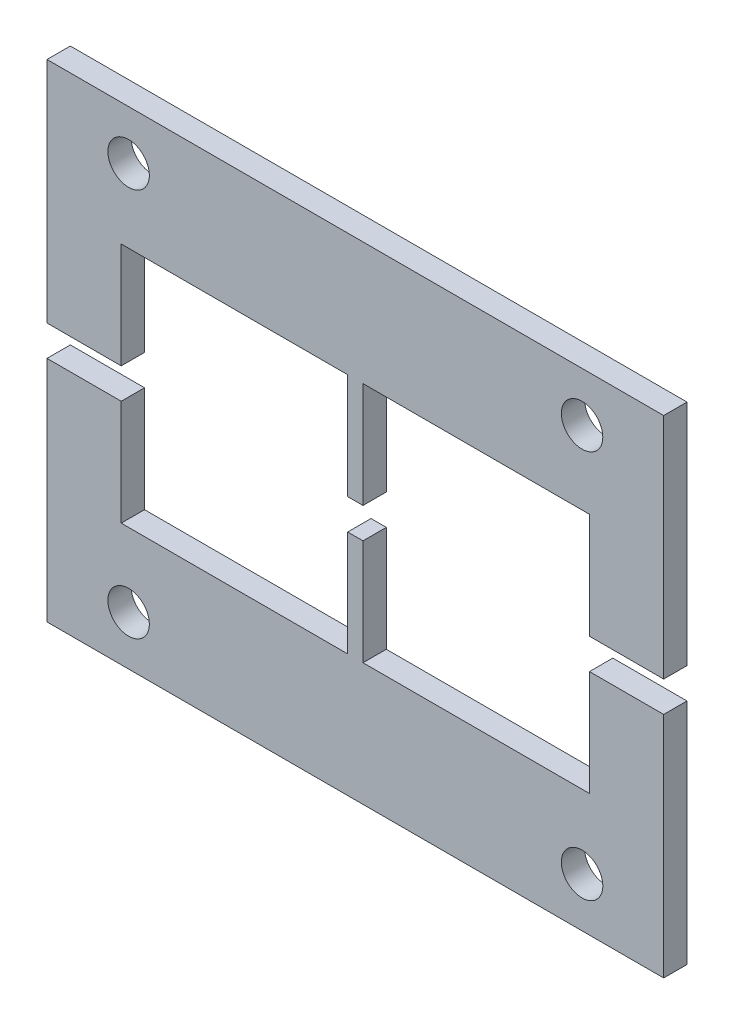
ISO-10303-21;
HEADER;
FILE_DESCRIPTION(('STEP AP214'),'2;1');
FILE_NAME('part.step','',(''),(''),'','','');
FILE_SCHEMA(('AUTOMOTIVE_DESIGN { 1 0 10303 214 1 1 1 1 }'));
ENDSEC;
DATA;
#1=APPLICATION_CONTEXT('core data for automotive mechanical design processes');
#2=APPLICATION_PROTOCOL_DEFINITION('international standard','automotive_design',2000,#1);
#3=PRODUCT_CONTEXT('',#1,'mechanical');
#4=PRODUCT('Part','Part','',(#3));
#5=PRODUCT_RELATED_PRODUCT_CATEGORY('part','',(#4));
#6=PRODUCT_DEFINITION_FORMATION('','',#4);
#7=PRODUCT_DEFINITION_CONTEXT('part definition',#1,'design');
#8=PRODUCT_DEFINITION('design','',#6,#7);
#9=PRODUCT_DEFINITION_SHAPE('','',#8);
#10=(LENGTH_UNIT() NAMED_UNIT(*) SI_UNIT(.MILLI.,.METRE.));
#11=(NAMED_UNIT(*) PLANE_ANGLE_UNIT() SI_UNIT($,.RADIAN.));
#12=(NAMED_UNIT(*) SI_UNIT($,.STERADIAN.) SOLID_ANGLE_UNIT());
#13=UNCERTAINTY_MEASURE_WITH_UNIT(LENGTH_MEASURE(1.E-05),#10,'distance_accuracy_value','');
#14=(GEOMETRIC_REPRESENTATION_CONTEXT(3) GLOBAL_UNCERTAINTY_ASSIGNED_CONTEXT((#13)) GLOBAL_UNIT_ASSIGNED_CONTEXT((#10,
#11,#12)) REPRESENTATION_CONTEXT('',''));
#15=CARTESIAN_POINT('',(0.,0.,0.));
#16=DIRECTION('',(0.,0.,1.));
#17=DIRECTION('',(1.,0.,0.));
#18=AXIS2_PLACEMENT_3D('',#15,#16,#17);
#19=CARTESIAN_POINT('',(0.,0.,2.286));
#20=DIRECTION('',(0.,0.,-1.));
#21=DIRECTION('',(-1.,0.,0.));
#22=AXIS2_PLACEMENT_3D('',#19,#20,#21);
#23=PLANE('',#22);
#24=DIRECTION('',(0.,-1.,0.));
#25=VECTOR('',#24,1.);
#26=CARTESIAN_POINT('',(22.95,-1.50000000000001,2.286));
#27=LINE('',#26,#25);
#28=CARTESIAN_POINT('',(22.95,-1.50000000000001,2.286));
#29=VERTEX_POINT('',#28);
#30=CARTESIAN_POINT('',(22.95,-11.85,2.286));
#31=VERTEX_POINT('',#30);
#32=EDGE_CURVE('E187',#29,#31,#27,.T.);
#33=ORIENTED_EDGE('',*,*,#32,.T.);
#34=DIRECTION('',(-1.,0.,0.));
#35=VECTOR('',#34,1.);
#36=CARTESIAN_POINT('',(22.95,-11.85,2.286));
#37=LINE('',#36,#35);
#38=CARTESIAN_POINT('',(0.750000000000001,-11.85,2.286));
#39=VERTEX_POINT('',#38);
#40=EDGE_CURVE('E115',#31,#39,#37,.T.);
#41=ORIENTED_EDGE('',*,*,#40,.T.);
#42=DIRECTION('',(0.,1.,0.));
#43=VECTOR('',#42,1.);
#44=CARTESIAN_POINT('',(0.750000000000001,-11.85,2.286));
#45=LINE('',#44,#43);
#46=CARTESIAN_POINT('',(0.750000000000002,-1.5,2.286));
#47=VERTEX_POINT('',#46);
#48=EDGE_CURVE('E214',#39,#47,#45,.T.);
#49=ORIENTED_EDGE('',*,*,#48,.T.);
#50=DIRECTION('',(-1.,0.,0.));
#51=VECTOR('',#50,1.);
#52=CARTESIAN_POINT('',(0.750000000000002,-1.5,2.286));
#53=LINE('',#52,#51);
#54=CARTESIAN_POINT('',(-0.750000000000002,-1.5,2.286));
#55=VERTEX_POINT('',#54);
#56=EDGE_CURVE('E233',#47,#55,#53,.T.);
#57=ORIENTED_EDGE('',*,*,#56,.T.);
#58=DIRECTION('',(0.,-1.,0.));
#59=VECTOR('',#58,1.);
#60=CARTESIAN_POINT('',(-0.750000000000001,-11.85,2.286));
#61=LINE('',#60,#59);
#62=CARTESIAN_POINT('',(-0.750000000000001,-11.85,2.286));
#63=VERTEX_POINT('',#62);
#64=EDGE_CURVE('E230',#55,#63,#61,.T.);
#65=ORIENTED_EDGE('',*,*,#64,.T.);
#66=DIRECTION('',(-1.,0.,0.));
#67=VECTOR('',#66,1.);
#68=CARTESIAN_POINT('',(-22.95,-11.85,2.286));
#69=LINE('',#68,#67);
#70=CARTESIAN_POINT('',(-22.95,-11.85,2.286));
#71=VERTEX_POINT('',#70);
#72=EDGE_CURVE('E232',#63,#71,#69,.T.);
#73=ORIENTED_EDGE('',*,*,#72,.T.);
#74=DIRECTION('',(0.,1.,0.));
#75=VECTOR('',#74,1.);
#76=CARTESIAN_POINT('',(-22.95,-1.50000000000001,2.286));
#77=LINE('',#76,#75);
#78=CARTESIAN_POINT('',(-22.95,-1.50000000000001,2.286));
#79=VERTEX_POINT('',#78);
#80=EDGE_CURVE('E235',#71,#79,#77,.T.);
#81=ORIENTED_EDGE('',*,*,#80,.T.);
#82=DIRECTION('',(-1.,0.,0.));
#83=VECTOR('',#82,1.);
#84=CARTESIAN_POINT('',(-22.95,-1.50000000000001,2.286));
#85=LINE('',#84,#83);
#86=CARTESIAN_POINT('',(-30.226,-1.5,2.286));
#87=VERTEX_POINT('',#86);
#88=EDGE_CURVE('E241',#79,#87,#85,.T.);
#89=ORIENTED_EDGE('',*,*,#88,.T.);
#90=DIRECTION('',(0.,-1.,0.));
#91=VECTOR('',#90,1.);
#92=CARTESIAN_POINT('',(-30.226,-23.876,2.286));
#93=LINE('',#92,#91);
#94=CARTESIAN_POINT('',(-30.226,-23.876,2.286));
#95=VERTEX_POINT('',#94);
#96=EDGE_CURVE('E146',#87,#95,#93,.T.);
#97=ORIENTED_EDGE('',*,*,#96,.T.);
#98=DIRECTION('',(1.,0.,0.));
#99=VECTOR('',#98,1.);
#100=CARTESIAN_POINT('',(-30.226,-23.876,2.286));
#101=LINE('',#100,#99);
#102=CARTESIAN_POINT('',(30.226,-23.876,2.286));
#103=VERTEX_POINT('',#102);
#104=EDGE_CURVE('E140',#95,#103,#101,.T.);
#105=ORIENTED_EDGE('',*,*,#104,.T.);
#106=DIRECTION('',(0.,1.,0.));
#107=VECTOR('',#106,1.);
#108=CARTESIAN_POINT('',(30.226,-23.876,2.286));
#109=LINE('',#108,#107);
#110=CARTESIAN_POINT('',(30.226,-1.5,2.286));
#111=VERTEX_POINT('',#110);
#112=EDGE_CURVE('E144',#103,#111,#109,.T.);
#113=ORIENTED_EDGE('',*,*,#112,.T.);
#114=DIRECTION('',(-1.,0.,0.));
#115=VECTOR('',#114,1.);
#116=CARTESIAN_POINT('',(22.95,-1.50000000000001,2.286));
#117=LINE('',#116,#115);
#118=EDGE_CURVE('E60',#111,#29,#117,.T.);
#119=ORIENTED_EDGE('',*,*,#118,.T.);
#120=EDGE_LOOP('',(#33,#41,#49,#57,#65,#73,#81,#89,#97,#105,#113,#119));
#121=FACE_BOUND('',#120,.T.);
#122=CARTESIAN_POINT('',(22.225,-19.05,2.286));
#123=DIRECTION('',(0.,0.,1.));
#124=DIRECTION('',(-1.,0.,0.));
#125=AXIS2_PLACEMENT_3D('',#122,#123,#124);
#126=CIRCLE('',#125,2.032);
#127=CARTESIAN_POINT('',(20.193,-19.05,2.286));
#128=VERTEX_POINT('',#127);
#129=EDGE_CURVE('E168',#128,#128,#126,.T.);
#130=ORIENTED_EDGE('',*,*,#129,.F.);
#131=EDGE_LOOP('',(#130));
#132=FACE_BOUND('',#131,.T.);
#133=CARTESIAN_POINT('',(-22.225,-19.05,2.286));
#134=DIRECTION('',(0.,0.,1.));
#135=DIRECTION('',(1.,0.,0.));
#136=AXIS2_PLACEMENT_3D('',#133,#134,#135);
#137=CIRCLE('',#136,2.032);
#138=CARTESIAN_POINT('',(-20.193,-19.05,2.286));
#139=VERTEX_POINT('',#138);
#140=EDGE_CURVE('E282',#139,#139,#137,.T.);
#141=ORIENTED_EDGE('',*,*,#140,.F.);
#142=EDGE_LOOP('',(#141));
#143=FACE_BOUND('',#142,.T.);
#144=ADVANCED_FACE('F43',(#121,#132,#143),#23,.F.);
#145=CARTESIAN_POINT('',(0.,0.,0.));
#146=DIRECTION('',(0.,0.,-1.));
#147=DIRECTION('',(-1.,0.,0.));
#148=AXIS2_PLACEMENT_3D('',#145,#146,#147);
#149=PLANE('',#148);
#150=CARTESIAN_POINT('',(22.225,-19.05,0.));
#151=DIRECTION('',(0.,0.,1.));
#152=DIRECTION('',(-1.,0.,0.));
#153=AXIS2_PLACEMENT_3D('',#150,#151,#152);
#154=CIRCLE('',#153,2.032);
#155=CARTESIAN_POINT('',(20.193,-19.05,0.));
#156=VERTEX_POINT('',#155);
#157=EDGE_CURVE('E287',#156,#156,#154,.T.);
#158=ORIENTED_EDGE('',*,*,#157,.T.);
#159=EDGE_LOOP('',(#158));
#160=FACE_BOUND('',#159,.T.);
#161=DIRECTION('',(0.,-1.,0.));
#162=VECTOR('',#161,1.);
#163=CARTESIAN_POINT('',(22.95,-1.50000000000001,0.));
#164=LINE('',#163,#162);
#165=CARTESIAN_POINT('',(22.95,-1.50000000000001,0.));
#166=VERTEX_POINT('',#165);
#167=CARTESIAN_POINT('',(22.95,-11.85,0.));
#168=VERTEX_POINT('',#167);
#169=EDGE_CURVE('E164',#166,#168,#164,.T.);
#170=ORIENTED_EDGE('',*,*,#169,.F.);
#171=DIRECTION('',(-1.,0.,0.));
#172=VECTOR('',#171,1.);
#173=CARTESIAN_POINT('',(22.95,-1.50000000000001,0.));
#174=LINE('',#173,#172);
#175=CARTESIAN_POINT('',(30.226,-1.5,0.));
#176=VERTEX_POINT('',#175);
#177=EDGE_CURVE('E107',#176,#166,#174,.T.);
#178=ORIENTED_EDGE('',*,*,#177,.F.);
#179=DIRECTION('',(0.,1.,0.));
#180=VECTOR('',#179,1.);
#181=CARTESIAN_POINT('',(30.226,-23.876,0.));
#182=LINE('',#181,#180);
#183=CARTESIAN_POINT('',(30.226,-23.876,0.));
#184=VERTEX_POINT('',#183);
#185=EDGE_CURVE('E101',#184,#176,#182,.T.);
#186=ORIENTED_EDGE('',*,*,#185,.F.);
#187=DIRECTION('',(1.,0.,0.));
#188=VECTOR('',#187,1.);
#189=CARTESIAN_POINT('',(-30.226,-23.876,0.));
#190=LINE('',#189,#188);
#191=CARTESIAN_POINT('',(-30.226,-23.876,0.));
#192=VERTEX_POINT('',#191);
#193=EDGE_CURVE('E154',#192,#184,#190,.T.);
#194=ORIENTED_EDGE('',*,*,#193,.F.);
#195=DIRECTION('',(0.,-1.,0.));
#196=VECTOR('',#195,1.);
#197=CARTESIAN_POINT('',(-30.226,-23.876,0.));
#198=LINE('',#197,#196);
#199=CARTESIAN_POINT('',(-30.226,-1.5,0.));
#200=VERTEX_POINT('',#199);
#201=EDGE_CURVE('E182',#200,#192,#198,.T.);
#202=ORIENTED_EDGE('',*,*,#201,.F.);
#203=DIRECTION('',(-1.,0.,0.));
#204=VECTOR('',#203,1.);
#205=CARTESIAN_POINT('',(-22.95,-1.50000000000001,0.));
#206=LINE('',#205,#204);
#207=CARTESIAN_POINT('',(-22.95,-1.50000000000001,0.));
#208=VERTEX_POINT('',#207);
#209=EDGE_CURVE('E180',#208,#200,#206,.T.);
#210=ORIENTED_EDGE('',*,*,#209,.F.);
#211=DIRECTION('',(0.,1.,0.));
#212=VECTOR('',#211,1.);
#213=CARTESIAN_POINT('',(-22.95,-1.50000000000001,0.));
#214=LINE('',#213,#212);
#215=CARTESIAN_POINT('',(-22.95,-11.85,0.));
#216=VERTEX_POINT('',#215);
#217=EDGE_CURVE('E178',#216,#208,#214,.T.);
#218=ORIENTED_EDGE('',*,*,#217,.F.);
#219=DIRECTION('',(-1.,0.,0.));
#220=VECTOR('',#219,1.);
#221=CARTESIAN_POINT('',(-22.95,-11.85,0.));
#222=LINE('',#221,#220);
#223=CARTESIAN_POINT('',(-0.750000000000001,-11.85,0.));
#224=VERTEX_POINT('',#223);
#225=EDGE_CURVE('E176',#224,#216,#222,.T.);
#226=ORIENTED_EDGE('',*,*,#225,.F.);
#227=DIRECTION('',(0.,-1.,0.));
#228=VECTOR('',#227,1.);
#229=CARTESIAN_POINT('',(-0.750000000000001,-11.85,0.));
#230=LINE('',#229,#228);
#231=CARTESIAN_POINT('',(-0.750000000000002,-1.5,0.));
#232=VERTEX_POINT('',#231);
#233=EDGE_CURVE('E174',#232,#224,#230,.T.);
#234=ORIENTED_EDGE('',*,*,#233,.F.);
#235=DIRECTION('',(-1.,0.,0.));
#236=VECTOR('',#235,1.);
#237=CARTESIAN_POINT('',(0.750000000000002,-1.5,0.));
#238=LINE('',#237,#236);
#239=CARTESIAN_POINT('',(0.750000000000002,-1.5,0.));
#240=VERTEX_POINT('',#239);
#241=EDGE_CURVE('E172',#240,#232,#238,.T.);
#242=ORIENTED_EDGE('',*,*,#241,.F.);
#243=DIRECTION('',(0.,1.,0.));
#244=VECTOR('',#243,1.);
#245=CARTESIAN_POINT('',(0.750000000000001,-11.85,0.));
#246=LINE('',#245,#244);
#247=CARTESIAN_POINT('',(0.750000000000001,-11.85,0.));
#248=VERTEX_POINT('',#247);
#249=EDGE_CURVE('E170',#248,#240,#246,.T.);
#250=ORIENTED_EDGE('',*,*,#249,.F.);
#251=DIRECTION('',(-1.,0.,0.));
#252=VECTOR('',#251,1.);
#253=CARTESIAN_POINT('',(22.95,-11.85,0.));
#254=LINE('',#253,#252);
#255=EDGE_CURVE('E167',#168,#248,#254,.T.);
#256=ORIENTED_EDGE('',*,*,#255,.F.);
#257=EDGE_LOOP('',(#170,#178,#186,#194,#202,#210,#218,#226,#234,#242,#250,#256));
#258=FACE_BOUND('',#257,.T.);
#259=CARTESIAN_POINT('',(-22.225,-19.05,0.));
#260=DIRECTION('',(0.,0.,1.));
#261=DIRECTION('',(1.,0.,0.));
#262=AXIS2_PLACEMENT_3D('',#259,#260,#261);
#263=CIRCLE('',#262,2.032);
#264=CARTESIAN_POINT('',(-20.193,-19.05,0.));
#265=VERTEX_POINT('',#264);
#266=EDGE_CURVE('E285',#265,#265,#263,.T.);
#267=ORIENTED_EDGE('',*,*,#266,.T.);
#268=EDGE_LOOP('',(#267));
#269=FACE_BOUND('',#268,.T.);
#270=ADVANCED_FACE('F218',(#160,#258,#269),#149,.T.);
#271=CARTESIAN_POINT('',(22.95,-1.50000000000001,2.286));
#272=DIRECTION('',(1.,0.,0.));
#273=DIRECTION('',(0.,1.,0.));
#274=AXIS2_PLACEMENT_3D('',#271,#272,#273);
#275=PLANE('',#274);
#276=ORIENTED_EDGE('',*,*,#169,.T.);
#277=DIRECTION('',(0.,0.,-1.));
#278=VECTOR('',#277,1.);
#279=CARTESIAN_POINT('',(22.95,-11.85,2.286));
#280=LINE('',#279,#278);
#281=EDGE_CURVE('E12',#31,#168,#280,.T.);
#282=ORIENTED_EDGE('',*,*,#281,.F.);
#283=ORIENTED_EDGE('',*,*,#32,.F.);
#284=DIRECTION('',(0.,0.,-1.));
#285=VECTOR('',#284,1.);
#286=CARTESIAN_POINT('',(22.95,-1.50000000000001,2.286));
#287=LINE('',#286,#285);
#288=EDGE_CURVE('E160',#29,#166,#287,.T.);
#289=ORIENTED_EDGE('',*,*,#288,.T.);
#290=EDGE_LOOP('',(#276,#282,#283,#289));
#291=FACE_BOUND('',#290,.T.);
#292=ADVANCED_FACE('F45',(#291),#275,.F.);
#293=CARTESIAN_POINT('',(22.95,-11.85,2.286));
#294=DIRECTION('',(0.,-1.,0.));
#295=DIRECTION('',(1.,0.,0.));
#296=AXIS2_PLACEMENT_3D('',#293,#294,#295);
#297=PLANE('',#296);
#298=ORIENTED_EDGE('',*,*,#255,.T.);
#299=DIRECTION('',(0.,0.,-1.));
#300=VECTOR('',#299,1.);
#301=CARTESIAN_POINT('',(0.750000000000001,-11.85,2.286));
#302=LINE('',#301,#300);
#303=EDGE_CURVE('E52',#39,#248,#302,.T.);
#304=ORIENTED_EDGE('',*,*,#303,.F.);
#305=ORIENTED_EDGE('',*,*,#40,.F.);
#306=ORIENTED_EDGE('',*,*,#281,.T.);
#307=EDGE_LOOP('',(#298,#304,#305,#306));
#308=FACE_BOUND('',#307,.T.);
#309=ADVANCED_FACE('F382',(#308),#297,.F.);
#310=CARTESIAN_POINT('',(0.750000000000001,-11.85,2.286));
#311=DIRECTION('',(-1.,0.,0.));
#312=DIRECTION('',(0.,-1.,0.));
#313=AXIS2_PLACEMENT_3D('',#310,#311,#312);
#314=PLANE('',#313);
#315=ORIENTED_EDGE('',*,*,#249,.T.);
#316=DIRECTION('',(0.,0.,-1.));
#317=VECTOR('',#316,1.);
#318=CARTESIAN_POINT('',(0.750000000000002,-1.5,2.286));
#319=LINE('',#318,#317);
#320=EDGE_CURVE('E206',#47,#240,#319,.T.);
#321=ORIENTED_EDGE('',*,*,#320,.F.);
#322=ORIENTED_EDGE('',*,*,#48,.F.);
#323=ORIENTED_EDGE('',*,*,#303,.T.);
#324=EDGE_LOOP('',(#315,#321,#322,#323));
#325=FACE_BOUND('',#324,.T.);
#326=ADVANCED_FACE('F212',(#325),#314,.F.);
#327=CARTESIAN_POINT('',(0.750000000000002,-1.5,2.286));
#328=DIRECTION('',(0.,-1.,0.));
#329=DIRECTION('',(0.,0.,-1.));
#330=AXIS2_PLACEMENT_3D('',#327,#328,#329);
#331=PLANE('',#330);
#332=ORIENTED_EDGE('',*,*,#241,.T.);
#333=DIRECTION('',(0.,0.,-1.));
#334=VECTOR('',#333,1.);
#335=CARTESIAN_POINT('',(-0.750000000000002,-1.5,2.286));
#336=LINE('',#335,#334);
#337=EDGE_CURVE('E203',#55,#232,#336,.T.);
#338=ORIENTED_EDGE('',*,*,#337,.F.);
#339=ORIENTED_EDGE('',*,*,#56,.F.);
#340=ORIENTED_EDGE('',*,*,#320,.T.);
#341=EDGE_LOOP('',(#332,#338,#339,#340));
#342=FACE_BOUND('',#341,.T.);
#343=ADVANCED_FACE('F224',(#342),#331,.F.);
#344=CARTESIAN_POINT('',(-0.750000000000001,-11.85,2.286));
#345=DIRECTION('',(1.,0.,0.));
#346=DIRECTION('',(0.,1.,0.));
#347=AXIS2_PLACEMENT_3D('',#344,#345,#346);
#348=PLANE('',#347);
#349=ORIENTED_EDGE('',*,*,#233,.T.);
#350=DIRECTION('',(0.,0.,-1.));
#351=VECTOR('',#350,1.);
#352=CARTESIAN_POINT('',(-0.750000000000001,-11.85,2.286));
#353=LINE('',#352,#351);
#354=EDGE_CURVE('E200',#63,#224,#353,.T.);
#355=ORIENTED_EDGE('',*,*,#354,.F.);
#356=ORIENTED_EDGE('',*,*,#64,.F.);
#357=ORIENTED_EDGE('',*,*,#337,.T.);
#358=EDGE_LOOP('',(#349,#355,#356,#357));
#359=FACE_BOUND('',#358,.T.);
#360=ADVANCED_FACE('F228',(#359),#348,.F.);
#361=CARTESIAN_POINT('',(-22.95,-11.85,2.286));
#362=DIRECTION('',(0.,-1.,0.));
#363=DIRECTION('',(1.,0.,0.));
#364=AXIS2_PLACEMENT_3D('',#361,#362,#363);
#365=PLANE('',#364);
#366=ORIENTED_EDGE('',*,*,#225,.T.);
#367=DIRECTION('',(0.,0.,-1.));
#368=VECTOR('',#367,1.);
#369=CARTESIAN_POINT('',(-22.95,-11.85,2.286));
#370=LINE('',#369,#368);
#371=EDGE_CURVE('E197',#71,#216,#370,.T.);
#372=ORIENTED_EDGE('',*,*,#371,.F.);
#373=ORIENTED_EDGE('',*,*,#72,.F.);
#374=ORIENTED_EDGE('',*,*,#354,.T.);
#375=EDGE_LOOP('',(#366,#372,#373,#374));
#376=FACE_BOUND('',#375,.T.);
#377=ADVANCED_FACE('F347',(#376),#365,.F.);
#378=CARTESIAN_POINT('',(-22.95,-1.50000000000001,2.286));
#379=DIRECTION('',(-1.,0.,0.));
#380=DIRECTION('',(0.,-1.,0.));
#381=AXIS2_PLACEMENT_3D('',#378,#379,#380);
#382=PLANE('',#381);
#383=ORIENTED_EDGE('',*,*,#217,.T.);
#384=DIRECTION('',(0.,0.,-1.));
#385=VECTOR('',#384,1.);
#386=CARTESIAN_POINT('',(-22.95,-1.50000000000001,2.286));
#387=LINE('',#386,#385);
#388=EDGE_CURVE('E194',#79,#208,#387,.T.);
#389=ORIENTED_EDGE('',*,*,#388,.F.);
#390=ORIENTED_EDGE('',*,*,#80,.F.);
#391=ORIENTED_EDGE('',*,*,#371,.T.);
#392=EDGE_LOOP('',(#383,#389,#390,#391));
#393=FACE_BOUND('',#392,.T.);
#394=ADVANCED_FACE('F338',(#393),#382,.F.);
#395=CARTESIAN_POINT('',(-22.95,-1.50000000000001,2.286));
#396=DIRECTION('',(0.,-1.,0.));
#397=DIRECTION('',(1.,0.,0.));
#398=AXIS2_PLACEMENT_3D('',#395,#396,#397);
#399=PLANE('',#398);
#400=ORIENTED_EDGE('',*,*,#209,.T.);
#401=DIRECTION('',(0.,0.,-1.));
#402=VECTOR('',#401,1.);
#403=CARTESIAN_POINT('',(-30.226,-1.5,2.286));
#404=LINE('',#403,#402);
#405=EDGE_CURVE('E191',#87,#200,#404,.T.);
#406=ORIENTED_EDGE('',*,*,#405,.F.);
#407=ORIENTED_EDGE('',*,*,#88,.F.);
#408=ORIENTED_EDGE('',*,*,#388,.T.);
#409=EDGE_LOOP('',(#400,#406,#407,#408));
#410=FACE_BOUND('',#409,.T.);
#411=ADVANCED_FACE('F247',(#410),#399,.F.);
#412=CARTESIAN_POINT('',(-30.226,-23.876,2.286));
#413=DIRECTION('',(1.,0.,0.));
#414=DIRECTION('',(0.,1.,0.));
#415=AXIS2_PLACEMENT_3D('',#412,#413,#414);
#416=PLANE('',#415);
#417=ORIENTED_EDGE('',*,*,#201,.T.);
#418=DIRECTION('',(0.,0.,-1.));
#419=VECTOR('',#418,1.);
#420=CARTESIAN_POINT('',(-30.226,-23.876,2.286));
#421=LINE('',#420,#419);
#422=EDGE_CURVE('E155',#95,#192,#421,.T.);
#423=ORIENTED_EDGE('',*,*,#422,.F.);
#424=ORIENTED_EDGE('',*,*,#96,.F.);
#425=ORIENTED_EDGE('',*,*,#405,.T.);
#426=EDGE_LOOP('',(#417,#423,#424,#425));
#427=FACE_BOUND('',#426,.T.);
#428=ADVANCED_FACE('F251',(#427),#416,.F.);
#429=CARTESIAN_POINT('',(-30.226,-23.876,2.286));
#430=DIRECTION('',(0.,1.,0.));
#431=DIRECTION('',(0.,0.,1.));
#432=AXIS2_PLACEMENT_3D('',#429,#430,#431);
#433=PLANE('',#432);
#434=ORIENTED_EDGE('',*,*,#193,.T.);
#435=DIRECTION('',(0.,0.,-1.));
#436=VECTOR('',#435,1.);
#437=CARTESIAN_POINT('',(30.226,-23.876,2.286));
#438=LINE('',#437,#436);
#439=EDGE_CURVE('E151',#103,#184,#438,.T.);
#440=ORIENTED_EDGE('',*,*,#439,.F.);
#441=ORIENTED_EDGE('',*,*,#104,.F.);
#442=ORIENTED_EDGE('',*,*,#422,.T.);
#443=EDGE_LOOP('',(#434,#440,#441,#442));
#444=FACE_BOUND('',#443,.T.);
#445=ADVANCED_FACE('F152',(#444),#433,.F.);
#446=CARTESIAN_POINT('',(30.226,-23.876,2.286));
#447=DIRECTION('',(-1.,0.,0.));
#448=DIRECTION('',(0.,-1.,0.));
#449=AXIS2_PLACEMENT_3D('',#446,#447,#448);
#450=PLANE('',#449);
#451=ORIENTED_EDGE('',*,*,#185,.T.);
#452=DIRECTION('',(0.,0.,-1.));
#453=VECTOR('',#452,1.);
#454=CARTESIAN_POINT('',(30.226,-1.5,2.286));
#455=LINE('',#454,#453);
#456=EDGE_CURVE('E156',#111,#176,#455,.T.);
#457=ORIENTED_EDGE('',*,*,#456,.F.);
#458=ORIENTED_EDGE('',*,*,#112,.F.);
#459=ORIENTED_EDGE('',*,*,#439,.T.);
#460=EDGE_LOOP('',(#451,#457,#458,#459));
#461=FACE_BOUND('',#460,.T.);
#462=ADVANCED_FACE('F158',(#461),#450,.F.);
#463=CARTESIAN_POINT('',(22.95,-1.50000000000001,2.286));
#464=DIRECTION('',(0.,-1.,0.));
#465=DIRECTION('',(1.,0.,0.));
#466=AXIS2_PLACEMENT_3D('',#463,#464,#465);
#467=PLANE('',#466);
#468=ORIENTED_EDGE('',*,*,#177,.T.);
#469=ORIENTED_EDGE('',*,*,#288,.F.);
#470=ORIENTED_EDGE('',*,*,#118,.F.);
#471=ORIENTED_EDGE('',*,*,#456,.T.);
#472=EDGE_LOOP('',(#468,#469,#470,#471));
#473=FACE_BOUND('',#472,.T.);
#474=ADVANCED_FACE('F255',(#473),#467,.F.);
#475=CARTESIAN_POINT('',(22.225,-19.05,2.286));
#476=DIRECTION('',(0.,0.,-1.));
#477=DIRECTION('',(-1.,0.,0.));
#478=AXIS2_PLACEMENT_3D('',#475,#476,#477);
#479=CYLINDRICAL_SURFACE('',#478,2.032);
#480=ORIENTED_EDGE('',*,*,#129,.T.);
#481=EDGE_LOOP('',(#480));
#482=FACE_BOUND('',#481,.T.);
#483=ORIENTED_EDGE('',*,*,#157,.F.);
#484=EDGE_LOOP('',(#483));
#485=FACE_BOUND('',#484,.T.);
#486=ADVANCED_FACE('F257',(#482,#485),#479,.F.);
#487=CARTESIAN_POINT('',(-22.225,-19.05,2.286));
#488=DIRECTION('',(0.,0.,-1.));
#489=DIRECTION('',(-1.,0.,0.));
#490=AXIS2_PLACEMENT_3D('',#487,#488,#489);
#491=CYLINDRICAL_SURFACE('',#490,2.032);
#492=ORIENTED_EDGE('',*,*,#140,.T.);
#493=EDGE_LOOP('',(#492));
#494=FACE_BOUND('',#493,.T.);
#495=ORIENTED_EDGE('',*,*,#266,.F.);
#496=EDGE_LOOP('',(#495));
#497=FACE_BOUND('',#496,.T.);
#498=ADVANCED_FACE('F263',(#494,#497),#491,.F.);
#499=CLOSED_SHELL('',(#144,#270,#292,#309,#326,#343,#360,#377,#394,#411,#428,#445,#462,#474,
#486,#498));
#500=MANIFOLD_SOLID_BREP('B2',#499);
#501=CARTESIAN_POINT('',(0.,0.,2.286));
#502=DIRECTION('',(0.,0.,1.));
#503=DIRECTION('',(1.,0.,0.));
#504=AXIS2_PLACEMENT_3D('',#501,#502,#503);
#505=PLANE('',#504);
#506=CARTESIAN_POINT('',(22.225,19.05,2.286));
#507=DIRECTION('',(0.,0.,1.));
#508=DIRECTION('',(1.,0.,0.));
#509=AXIS2_PLACEMENT_3D('',#506,#507,#508);
#510=CIRCLE('',#509,2.032);
#511=CARTESIAN_POINT('',(24.257,19.05,2.286));
#512=VERTEX_POINT('',#511);
#513=EDGE_CURVE('E542',#512,#512,#510,.T.);
#514=ORIENTED_EDGE('',*,*,#513,.F.);
#515=EDGE_LOOP('',(#514));
#516=FACE_BOUND('',#515,.T.);
#517=DIRECTION('',(0.,1.,0.));
#518=VECTOR('',#517,1.);
#519=CARTESIAN_POINT('',(30.226,23.876,2.286));
#520=LINE('',#519,#518);
#521=CARTESIAN_POINT('',(30.226,1.5,2.286));
#522=VERTEX_POINT('',#521);
#523=CARTESIAN_POINT('',(30.226,23.876,2.286));
#524=VERTEX_POINT('',#523);
#525=EDGE_CURVE('E561',#522,#524,#520,.T.);
#526=ORIENTED_EDGE('',*,*,#525,.T.);
#527=DIRECTION('',(-1.,0.,0.));
#528=VECTOR('',#527,1.);
#529=CARTESIAN_POINT('',(-30.226,23.876,2.286));
#530=LINE('',#529,#528);
#531=CARTESIAN_POINT('',(-30.226,23.876,2.286));
#532=VERTEX_POINT('',#531);
#533=EDGE_CURVE('E489',#524,#532,#530,.T.);
#534=ORIENTED_EDGE('',*,*,#533,.T.);
#535=DIRECTION('',(0.,-1.,0.));
#536=VECTOR('',#535,1.);
#537=CARTESIAN_POINT('',(-30.226,23.876,2.286));
#538=LINE('',#537,#536);
#539=CARTESIAN_POINT('',(-30.226,1.5,2.286));
#540=VERTEX_POINT('',#539);
#541=EDGE_CURVE('E588',#532,#540,#538,.T.);
#542=ORIENTED_EDGE('',*,*,#541,.T.);
#543=DIRECTION('',(1.,0.,0.));
#544=VECTOR('',#543,1.);
#545=CARTESIAN_POINT('',(-22.95,1.50000000000001,2.286));
#546=LINE('',#545,#544);
#547=CARTESIAN_POINT('',(-22.95,1.50000000000001,2.286));
#548=VERTEX_POINT('',#547);
#549=EDGE_CURVE('E607',#540,#548,#546,.T.);
#550=ORIENTED_EDGE('',*,*,#549,.T.);
#551=DIRECTION('',(0.,1.,0.));
#552=VECTOR('',#551,1.);
#553=CARTESIAN_POINT('',(-22.95,1.50000000000001,2.286));
#554=LINE('',#553,#552);
#555=CARTESIAN_POINT('',(-22.95,11.85,2.286));
#556=VERTEX_POINT('',#555);
#557=EDGE_CURVE('E604',#548,#556,#554,.T.);
#558=ORIENTED_EDGE('',*,*,#557,.T.);
#559=DIRECTION('',(1.,0.,0.));
#560=VECTOR('',#559,1.);
#561=CARTESIAN_POINT('',(-22.95,11.85,2.286));
#562=LINE('',#561,#560);
#563=CARTESIAN_POINT('',(-0.750000000000001,11.85,2.286));
#564=VERTEX_POINT('',#563);
#565=EDGE_CURVE('E606',#556,#564,#562,.T.);
#566=ORIENTED_EDGE('',*,*,#565,.T.);
#567=DIRECTION('',(0.,-1.,0.));
#568=VECTOR('',#567,1.);
#569=CARTESIAN_POINT('',(-0.750000000000001,11.85,2.286));
#570=LINE('',#569,#568);
#571=CARTESIAN_POINT('',(-0.750000000000002,1.5,2.286));
#572=VERTEX_POINT('',#571);
#573=EDGE_CURVE('E609',#564,#572,#570,.T.);
#574=ORIENTED_EDGE('',*,*,#573,.T.);
#575=DIRECTION('',(1.,0.,0.));
#576=VECTOR('',#575,1.);
#577=CARTESIAN_POINT('',(0.750000000000002,1.5,2.286));
#578=LINE('',#577,#576);
#579=CARTESIAN_POINT('',(0.750000000000002,1.5,2.286));
#580=VERTEX_POINT('',#579);
#581=EDGE_CURVE('E615',#572,#580,#578,.T.);
#582=ORIENTED_EDGE('',*,*,#581,.T.);
#583=DIRECTION('',(0.,1.,0.));
#584=VECTOR('',#583,1.);
#585=CARTESIAN_POINT('',(0.750000000000001,11.85,2.286));
#586=LINE('',#585,#584);
#587=CARTESIAN_POINT('',(0.750000000000001,11.85,2.286));
#588=VERTEX_POINT('',#587);
#589=EDGE_CURVE('E520',#580,#588,#586,.T.);
#590=ORIENTED_EDGE('',*,*,#589,.T.);
#591=DIRECTION('',(1.,0.,0.));
#592=VECTOR('',#591,1.);
#593=CARTESIAN_POINT('',(22.95,11.85,2.286));
#594=LINE('',#593,#592);
#595=CARTESIAN_POINT('',(22.95,11.85,2.286));
#596=VERTEX_POINT('',#595);
#597=EDGE_CURVE('E514',#588,#596,#594,.T.);
#598=ORIENTED_EDGE('',*,*,#597,.T.);
#599=DIRECTION('',(0.,-1.,0.));
#600=VECTOR('',#599,1.);
#601=CARTESIAN_POINT('',(22.95,1.50000000000001,2.286));
#602=LINE('',#601,#600);
#603=CARTESIAN_POINT('',(22.95,1.50000000000001,2.286));
#604=VERTEX_POINT('',#603);
#605=EDGE_CURVE('E518',#596,#604,#602,.T.);
#606=ORIENTED_EDGE('',*,*,#605,.T.);
#607=DIRECTION('',(1.,0.,0.));
#608=VECTOR('',#607,1.);
#609=CARTESIAN_POINT('',(22.95,1.50000000000001,2.286));
#610=LINE('',#609,#608);
#611=EDGE_CURVE('E434',#604,#522,#610,.T.);
#612=ORIENTED_EDGE('',*,*,#611,.T.);
#613=EDGE_LOOP('',(#526,#534,#542,#550,#558,#566,#574,#582,#590,#598,#606,#612));
#614=FACE_BOUND('',#613,.T.);
#615=CARTESIAN_POINT('',(-22.225,19.05,2.286));
#616=DIRECTION('',(0.,0.,1.));
#617=DIRECTION('',(-1.,0.,0.));
#618=AXIS2_PLACEMENT_3D('',#615,#616,#617);
#619=CIRCLE('',#618,2.032);
#620=CARTESIAN_POINT('',(-24.257,19.05,2.286));
#621=VERTEX_POINT('',#620);
#622=EDGE_CURVE('E657',#621,#621,#619,.T.);
#623=ORIENTED_EDGE('',*,*,#622,.F.);
#624=EDGE_LOOP('',(#623));
#625=FACE_BOUND('',#624,.T.);
#626=ADVANCED_FACE('F417',(#516,#614,#625),#505,.T.);
#627=CARTESIAN_POINT('',(0.,0.,0.));
#628=DIRECTION('',(0.,0.,1.));
#629=DIRECTION('',(1.,0.,0.));
#630=AXIS2_PLACEMENT_3D('',#627,#628,#629);
#631=PLANE('',#630);
#632=DIRECTION('',(0.,1.,0.));
#633=VECTOR('',#632,1.);
#634=CARTESIAN_POINT('',(30.226,23.876,0.));
#635=LINE('',#634,#633);
#636=CARTESIAN_POINT('',(30.226,1.5,0.));
#637=VERTEX_POINT('',#636);
#638=CARTESIAN_POINT('',(30.226,23.876,0.));
#639=VERTEX_POINT('',#638);
#640=EDGE_CURVE('E538',#637,#639,#635,.T.);
#641=ORIENTED_EDGE('',*,*,#640,.F.);
#642=DIRECTION('',(1.,0.,0.));
#643=VECTOR('',#642,1.);
#644=CARTESIAN_POINT('',(22.95,1.50000000000001,0.));
#645=LINE('',#644,#643);
#646=CARTESIAN_POINT('',(22.95,1.50000000000001,0.));
#647=VERTEX_POINT('',#646);
#648=EDGE_CURVE('E481',#647,#637,#645,.T.);
#649=ORIENTED_EDGE('',*,*,#648,.F.);
#650=DIRECTION('',(0.,-1.,0.));
#651=VECTOR('',#650,1.);
#652=CARTESIAN_POINT('',(22.95,1.50000000000001,0.));
#653=LINE('',#652,#651);
#654=CARTESIAN_POINT('',(22.95,11.85,0.));
#655=VERTEX_POINT('',#654);
#656=EDGE_CURVE('E475',#655,#647,#653,.T.);
#657=ORIENTED_EDGE('',*,*,#656,.F.);
#658=DIRECTION('',(1.,0.,0.));
#659=VECTOR('',#658,1.);
#660=CARTESIAN_POINT('',(22.95,11.85,0.));
#661=LINE('',#660,#659);
#662=CARTESIAN_POINT('',(0.750000000000001,11.85,0.));
#663=VERTEX_POINT('',#662);
#664=EDGE_CURVE('E528',#663,#655,#661,.T.);
#665=ORIENTED_EDGE('',*,*,#664,.F.);
#666=DIRECTION('',(0.,1.,0.));
#667=VECTOR('',#666,1.);
#668=CARTESIAN_POINT('',(0.750000000000001,11.85,0.));
#669=LINE('',#668,#667);
#670=CARTESIAN_POINT('',(0.750000000000002,1.5,0.));
#671=VERTEX_POINT('',#670);
#672=EDGE_CURVE('E556',#671,#663,#669,.T.);
#673=ORIENTED_EDGE('',*,*,#672,.F.);
#674=DIRECTION('',(1.,0.,0.));
#675=VECTOR('',#674,1.);
#676=CARTESIAN_POINT('',(0.750000000000002,1.5,0.));
#677=LINE('',#676,#675);
#678=CARTESIAN_POINT('',(-0.750000000000002,1.5,0.));
#679=VERTEX_POINT('',#678);
#680=EDGE_CURVE('E554',#679,#671,#677,.T.);
#681=ORIENTED_EDGE('',*,*,#680,.F.);
#682=DIRECTION('',(0.,-1.,0.));
#683=VECTOR('',#682,1.);
#684=CARTESIAN_POINT('',(-0.750000000000001,11.85,0.));
#685=LINE('',#684,#683);
#686=CARTESIAN_POINT('',(-0.750000000000001,11.85,0.));
#687=VERTEX_POINT('',#686);
#688=EDGE_CURVE('E552',#687,#679,#685,.T.);
#689=ORIENTED_EDGE('',*,*,#688,.F.);
#690=DIRECTION('',(1.,0.,0.));
#691=VECTOR('',#690,1.);
#692=CARTESIAN_POINT('',(-22.95,11.85,0.));
#693=LINE('',#692,#691);
#694=CARTESIAN_POINT('',(-22.95,11.85,0.));
#695=VERTEX_POINT('',#694);
#696=EDGE_CURVE('E550',#695,#687,#693,.T.);
#697=ORIENTED_EDGE('',*,*,#696,.F.);
#698=DIRECTION('',(0.,1.,0.));
#699=VECTOR('',#698,1.);
#700=CARTESIAN_POINT('',(-22.95,1.50000000000001,0.));
#701=LINE('',#700,#699);
#702=CARTESIAN_POINT('',(-22.95,1.50000000000001,0.));
#703=VERTEX_POINT('',#702);
#704=EDGE_CURVE('E548',#703,#695,#701,.T.);
#705=ORIENTED_EDGE('',*,*,#704,.F.);
#706=DIRECTION('',(1.,0.,0.));
#707=VECTOR('',#706,1.);
#708=CARTESIAN_POINT('',(-22.95,1.50000000000001,0.));
#709=LINE('',#708,#707);
#710=CARTESIAN_POINT('',(-30.226,1.5,0.));
#711=VERTEX_POINT('',#710);
#712=EDGE_CURVE('E546',#711,#703,#709,.T.);
#713=ORIENTED_EDGE('',*,*,#712,.F.);
#714=DIRECTION('',(0.,-1.,0.));
#715=VECTOR('',#714,1.);
#716=CARTESIAN_POINT('',(-30.226,23.876,0.));
#717=LINE('',#716,#715);
#718=CARTESIAN_POINT('',(-30.226,23.876,0.));
#719=VERTEX_POINT('',#718);
#720=EDGE_CURVE('E544',#719,#711,#717,.T.);
#721=ORIENTED_EDGE('',*,*,#720,.F.);
#722=DIRECTION('',(-1.,0.,0.));
#723=VECTOR('',#722,1.);
#724=CARTESIAN_POINT('',(-30.226,23.876,0.));
#725=LINE('',#724,#723);
#726=EDGE_CURVE('E541',#639,#719,#725,.T.);
#727=ORIENTED_EDGE('',*,*,#726,.F.);
#728=EDGE_LOOP('',(#641,#649,#657,#665,#673,#681,#689,#697,#705,#713,#721,#727));
#729=FACE_BOUND('',#728,.T.);
#730=CARTESIAN_POINT('',(22.225,19.05,0.));
#731=DIRECTION('',(0.,0.,1.));
#732=DIRECTION('',(1.,0.,0.));
#733=AXIS2_PLACEMENT_3D('',#730,#731,#732);
#734=CIRCLE('',#733,2.032);
#735=CARTESIAN_POINT('',(24.257,19.05,0.));
#736=VERTEX_POINT('',#735);
#737=EDGE_CURVE('E663',#736,#736,#734,.T.);
#738=ORIENTED_EDGE('',*,*,#737,.T.);
#739=EDGE_LOOP('',(#738));
#740=FACE_BOUND('',#739,.T.);
#741=CARTESIAN_POINT('',(-22.225,19.05,0.));
#742=DIRECTION('',(0.,0.,1.));
#743=DIRECTION('',(-1.,0.,0.));
#744=AXIS2_PLACEMENT_3D('',#741,#742,#743);
#745=CIRCLE('',#744,2.032);
#746=CARTESIAN_POINT('',(-24.257,19.05,0.));
#747=VERTEX_POINT('',#746);
#748=EDGE_CURVE('E660',#747,#747,#745,.T.);
#749=ORIENTED_EDGE('',*,*,#748,.T.);
#750=EDGE_LOOP('',(#749));
#751=FACE_BOUND('',#750,.T.);
#752=ADVANCED_FACE('F592',(#729,#740,#751),#631,.F.);
#753=CARTESIAN_POINT('',(30.226,23.876,2.286));
#754=DIRECTION('',(-1.,0.,0.));
#755=DIRECTION('',(0.,-1.,0.));
#756=AXIS2_PLACEMENT_3D('',#753,#754,#755);
#757=PLANE('',#756);
#758=ORIENTED_EDGE('',*,*,#640,.T.);
#759=DIRECTION('',(0.,0.,-1.));
#760=VECTOR('',#759,1.);
#761=CARTESIAN_POINT('',(30.226,23.876,2.286));
#762=LINE('',#761,#760);
#763=EDGE_CURVE('E41',#524,#639,#762,.T.);
#764=ORIENTED_EDGE('',*,*,#763,.F.);
#765=ORIENTED_EDGE('',*,*,#525,.F.);
#766=DIRECTION('',(0.,0.,-1.));
#767=VECTOR('',#766,1.);
#768=CARTESIAN_POINT('',(30.226,1.5,2.286));
#769=LINE('',#768,#767);
#770=EDGE_CURVE('E534',#522,#637,#769,.T.);
#771=ORIENTED_EDGE('',*,*,#770,.T.);
#772=EDGE_LOOP('',(#758,#764,#765,#771));
#773=FACE_BOUND('',#772,.T.);
#774=ADVANCED_FACE('F419',(#773),#757,.F.);
#775=CARTESIAN_POINT('',(-30.226,23.876,2.286));
#776=DIRECTION('',(0.,-1.,0.));
#777=DIRECTION('',(0.,0.,-1.));
#778=AXIS2_PLACEMENT_3D('',#775,#776,#777);
#779=PLANE('',#778);
#780=ORIENTED_EDGE('',*,*,#726,.T.);
#781=DIRECTION('',(0.,0.,-1.));
#782=VECTOR('',#781,1.);
#783=CARTESIAN_POINT('',(-30.226,23.876,2.286));
#784=LINE('',#783,#782);
#785=EDGE_CURVE('E426',#532,#719,#784,.T.);
#786=ORIENTED_EDGE('',*,*,#785,.F.);
#787=ORIENTED_EDGE('',*,*,#533,.F.);
#788=ORIENTED_EDGE('',*,*,#763,.T.);
#789=EDGE_LOOP('',(#780,#786,#787,#788));
#790=FACE_BOUND('',#789,.T.);
#791=ADVANCED_FACE('F756',(#790),#779,.F.);
#792=CARTESIAN_POINT('',(-30.226,23.876,2.286));
#793=DIRECTION('',(1.,0.,0.));
#794=DIRECTION('',(0.,1.,0.));
#795=AXIS2_PLACEMENT_3D('',#792,#793,#794);
#796=PLANE('',#795);
#797=ORIENTED_EDGE('',*,*,#720,.T.);
#798=DIRECTION('',(0.,0.,-1.));
#799=VECTOR('',#798,1.);
#800=CARTESIAN_POINT('',(-30.226,1.5,2.286));
#801=LINE('',#800,#799);
#802=EDGE_CURVE('E580',#540,#711,#801,.T.);
#803=ORIENTED_EDGE('',*,*,#802,.F.);
#804=ORIENTED_EDGE('',*,*,#541,.F.);
#805=ORIENTED_EDGE('',*,*,#785,.T.);
#806=EDGE_LOOP('',(#797,#803,#804,#805));
#807=FACE_BOUND('',#806,.T.);
#808=ADVANCED_FACE('F586',(#807),#796,.F.);
#809=CARTESIAN_POINT('',(-22.95,1.50000000000001,2.286));
#810=DIRECTION('',(0.,1.,0.));
#811=DIRECTION('',(-1.,0.,0.));
#812=AXIS2_PLACEMENT_3D('',#809,#810,#811);
#813=PLANE('',#812);
#814=ORIENTED_EDGE('',*,*,#712,.T.);
#815=DIRECTION('',(0.,0.,-1.));
#816=VECTOR('',#815,1.);
#817=CARTESIAN_POINT('',(-22.95,1.50000000000001,2.286));
#818=LINE('',#817,#816);
#819=EDGE_CURVE('E577',#548,#703,#818,.T.);
#820=ORIENTED_EDGE('',*,*,#819,.F.);
#821=ORIENTED_EDGE('',*,*,#549,.F.);
#822=ORIENTED_EDGE('',*,*,#802,.T.);
#823=EDGE_LOOP('',(#814,#820,#821,#822));
#824=FACE_BOUND('',#823,.T.);
#825=ADVANCED_FACE('F598',(#824),#813,.F.);
#826=CARTESIAN_POINT('',(-22.95,1.50000000000001,2.286));
#827=DIRECTION('',(-1.,0.,0.));
#828=DIRECTION('',(0.,-1.,0.));
#829=AXIS2_PLACEMENT_3D('',#826,#827,#828);
#830=PLANE('',#829);
#831=ORIENTED_EDGE('',*,*,#704,.T.);
#832=DIRECTION('',(0.,0.,-1.));
#833=VECTOR('',#832,1.);
#834=CARTESIAN_POINT('',(-22.95,11.85,2.286));
#835=LINE('',#834,#833);
#836=EDGE_CURVE('E574',#556,#695,#835,.T.);
#837=ORIENTED_EDGE('',*,*,#836,.F.);
#838=ORIENTED_EDGE('',*,*,#557,.F.);
#839=ORIENTED_EDGE('',*,*,#819,.T.);
#840=EDGE_LOOP('',(#831,#837,#838,#839));
#841=FACE_BOUND('',#840,.T.);
#842=ADVANCED_FACE('F602',(#841),#830,.F.);
#843=CARTESIAN_POINT('',(-22.95,11.85,2.286));
#844=DIRECTION('',(0.,1.,0.));
#845=DIRECTION('',(-1.,0.,0.));
#846=AXIS2_PLACEMENT_3D('',#843,#844,#845);
#847=PLANE('',#846);
#848=ORIENTED_EDGE('',*,*,#696,.T.);
#849=DIRECTION('',(0.,0.,-1.));
#850=VECTOR('',#849,1.);
#851=CARTESIAN_POINT('',(-0.750000000000001,11.85,2.286));
#852=LINE('',#851,#850);
#853=EDGE_CURVE('E571',#564,#687,#852,.T.);
#854=ORIENTED_EDGE('',*,*,#853,.F.);
#855=ORIENTED_EDGE('',*,*,#565,.F.);
#856=ORIENTED_EDGE('',*,*,#836,.T.);
#857=EDGE_LOOP('',(#848,#854,#855,#856));
#858=FACE_BOUND('',#857,.T.);
#859=ADVANCED_FACE('F721',(#858),#847,.F.);
#860=CARTESIAN_POINT('',(-0.750000000000001,11.85,2.286));
#861=DIRECTION('',(1.,0.,0.));
#862=DIRECTION('',(0.,1.,0.));
#863=AXIS2_PLACEMENT_3D('',#860,#861,#862);
#864=PLANE('',#863);
#865=ORIENTED_EDGE('',*,*,#688,.T.);
#866=DIRECTION('',(0.,0.,-1.));
#867=VECTOR('',#866,1.);
#868=CARTESIAN_POINT('',(-0.750000000000002,1.5,2.286));
#869=LINE('',#868,#867);
#870=EDGE_CURVE('E568',#572,#679,#869,.T.);
#871=ORIENTED_EDGE('',*,*,#870,.F.);
#872=ORIENTED_EDGE('',*,*,#573,.F.);
#873=ORIENTED_EDGE('',*,*,#853,.T.);
#874=EDGE_LOOP('',(#865,#871,#872,#873));
#875=FACE_BOUND('',#874,.T.);
#876=ADVANCED_FACE('F712',(#875),#864,.F.);
#877=CARTESIAN_POINT('',(0.750000000000002,1.5,2.286));
#878=DIRECTION('',(0.,1.,0.));
#879=DIRECTION('',(0.,0.,1.));
#880=AXIS2_PLACEMENT_3D('',#877,#878,#879);
#881=PLANE('',#880);
#882=ORIENTED_EDGE('',*,*,#680,.T.);
#883=DIRECTION('',(0.,0.,-1.));
#884=VECTOR('',#883,1.);
#885=CARTESIAN_POINT('',(0.750000000000002,1.5,2.286));
#886=LINE('',#885,#884);
#887=EDGE_CURVE('E565',#580,#671,#886,.T.);
#888=ORIENTED_EDGE('',*,*,#887,.F.);
#889=ORIENTED_EDGE('',*,*,#581,.F.);
#890=ORIENTED_EDGE('',*,*,#870,.T.);
#891=EDGE_LOOP('',(#882,#888,#889,#890));
#892=FACE_BOUND('',#891,.T.);
#893=ADVANCED_FACE('F621',(#892),#881,.F.);
#894=CARTESIAN_POINT('',(0.750000000000001,11.85,2.286));
#895=DIRECTION('',(-1.,0.,0.));
#896=DIRECTION('',(0.,-1.,0.));
#897=AXIS2_PLACEMENT_3D('',#894,#895,#896);
#898=PLANE('',#897);
#899=ORIENTED_EDGE('',*,*,#672,.T.);
#900=DIRECTION('',(0.,0.,-1.));
#901=VECTOR('',#900,1.);
#902=CARTESIAN_POINT('',(0.750000000000001,11.85,2.286));
#903=LINE('',#902,#901);
#904=EDGE_CURVE('E529',#588,#663,#903,.T.);
#905=ORIENTED_EDGE('',*,*,#904,.F.);
#906=ORIENTED_EDGE('',*,*,#589,.F.);
#907=ORIENTED_EDGE('',*,*,#887,.T.);
#908=EDGE_LOOP('',(#899,#905,#906,#907));
#909=FACE_BOUND('',#908,.T.);
#910=ADVANCED_FACE('F625',(#909),#898,.F.);
#911=CARTESIAN_POINT('',(22.95,11.85,2.286));
#912=DIRECTION('',(0.,1.,0.));
#913=DIRECTION('',(-1.,0.,0.));
#914=AXIS2_PLACEMENT_3D('',#911,#912,#913);
#915=PLANE('',#914);
#916=ORIENTED_EDGE('',*,*,#664,.T.);
#917=DIRECTION('',(0.,0.,-1.));
#918=VECTOR('',#917,1.);
#919=CARTESIAN_POINT('',(22.95,11.85,2.286));
#920=LINE('',#919,#918);
#921=EDGE_CURVE('E525',#596,#655,#920,.T.);
#922=ORIENTED_EDGE('',*,*,#921,.F.);
#923=ORIENTED_EDGE('',*,*,#597,.F.);
#924=ORIENTED_EDGE('',*,*,#904,.T.);
#925=EDGE_LOOP('',(#916,#922,#923,#924));
#926=FACE_BOUND('',#925,.T.);
#927=ADVANCED_FACE('F526',(#926),#915,.F.);
#928=CARTESIAN_POINT('',(22.95,1.50000000000001,2.286));
#929=DIRECTION('',(1.,0.,0.));
#930=DIRECTION('',(0.,1.,0.));
#931=AXIS2_PLACEMENT_3D('',#928,#929,#930);
#932=PLANE('',#931);
#933=ORIENTED_EDGE('',*,*,#656,.T.);
#934=DIRECTION('',(0.,0.,-1.));
#935=VECTOR('',#934,1.);
#936=CARTESIAN_POINT('',(22.95,1.50000000000001,2.286));
#937=LINE('',#936,#935);
#938=EDGE_CURVE('E530',#604,#647,#937,.T.);
#939=ORIENTED_EDGE('',*,*,#938,.F.);
#940=ORIENTED_EDGE('',*,*,#605,.F.);
#941=ORIENTED_EDGE('',*,*,#921,.T.);
#942=EDGE_LOOP('',(#933,#939,#940,#941));
#943=FACE_BOUND('',#942,.T.);
#944=ADVANCED_FACE('F532',(#943),#932,.F.);
#945=CARTESIAN_POINT('',(22.95,1.50000000000001,2.286));
#946=DIRECTION('',(0.,1.,0.));
#947=DIRECTION('',(-1.,0.,0.));
#948=AXIS2_PLACEMENT_3D('',#945,#946,#947);
#949=PLANE('',#948);
#950=ORIENTED_EDGE('',*,*,#648,.T.);
#951=ORIENTED_EDGE('',*,*,#770,.F.);
#952=ORIENTED_EDGE('',*,*,#611,.F.);
#953=ORIENTED_EDGE('',*,*,#938,.T.);
#954=EDGE_LOOP('',(#950,#951,#952,#953));
#955=FACE_BOUND('',#954,.T.);
#956=ADVANCED_FACE('F629',(#955),#949,.F.);
#957=CARTESIAN_POINT('',(22.225,19.05,2.286));
#958=DIRECTION('',(0.,0.,-1.));
#959=DIRECTION('',(-1.,0.,0.));
#960=AXIS2_PLACEMENT_3D('',#957,#958,#959);
#961=CYLINDRICAL_SURFACE('',#960,2.032);
#962=ORIENTED_EDGE('',*,*,#513,.T.);
#963=EDGE_LOOP('',(#962));
#964=FACE_BOUND('',#963,.T.);
#965=ORIENTED_EDGE('',*,*,#737,.F.);
#966=EDGE_LOOP('',(#965));
#967=FACE_BOUND('',#966,.T.);
#968=ADVANCED_FACE('F631',(#964,#967),#961,.F.);
#969=CARTESIAN_POINT('',(-22.225,19.05,2.286));
#970=DIRECTION('',(0.,0.,-1.));
#971=DIRECTION('',(-1.,0.,0.));
#972=AXIS2_PLACEMENT_3D('',#969,#970,#971);
#973=CYLINDRICAL_SURFACE('',#972,2.032);
#974=ORIENTED_EDGE('',*,*,#622,.T.);
#975=EDGE_LOOP('',(#974));
#976=FACE_BOUND('',#975,.T.);
#977=ORIENTED_EDGE('',*,*,#748,.F.);
#978=EDGE_LOOP('',(#977));
#979=FACE_BOUND('',#978,.T.);
#980=ADVANCED_FACE('F637',(#976,#979),#973,.F.);
#981=CLOSED_SHELL('',(#626,#752,#774,#791,#808,#825,#842,#859,#876,#893,#910,#927,#944,#956,
#968,#980));
#982=MANIFOLD_SOLID_BREP('B6',#981);
#983=ADVANCED_BREP_SHAPE_REPRESENTATION('',(#18,#500,#982),#14);
#984=SHAPE_DEFINITION_REPRESENTATION(#9,#983);
ENDSEC;
END-ISO-10303-21;
